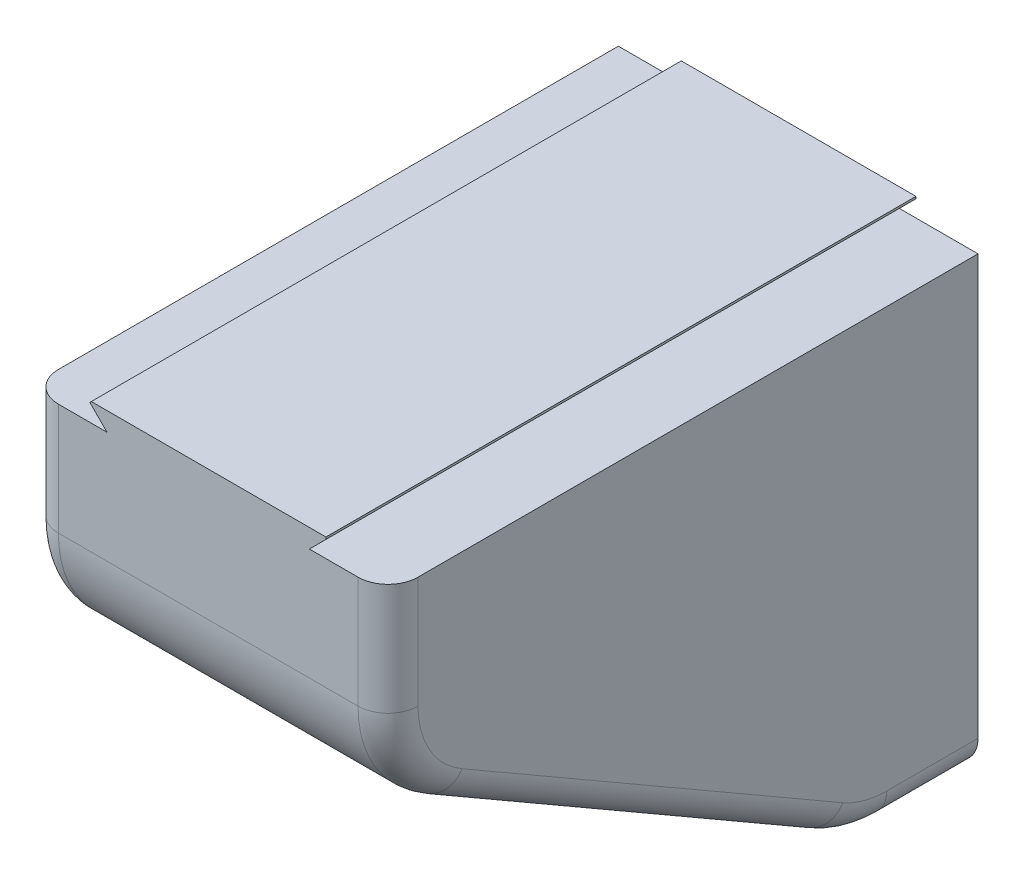
ISO-10303-21;
HEADER;
FILE_DESCRIPTION(('STEP AP214'),'2;1');
FILE_NAME('part.step','',(''),(''),'','','');
FILE_SCHEMA(('AUTOMOTIVE_DESIGN { 1 0 10303 214 1 1 1 1 }'));
ENDSEC;
DATA;
#1=APPLICATION_CONTEXT('core data for automotive mechanical design processes');
#2=APPLICATION_PROTOCOL_DEFINITION('international standard','automotive_design',2000,#1);
#3=PRODUCT_CONTEXT('',#1,'mechanical');
#4=PRODUCT('Part','Part','',(#3));
#5=PRODUCT_RELATED_PRODUCT_CATEGORY('part','',(#4));
#6=PRODUCT_DEFINITION_FORMATION('','',#4);
#7=PRODUCT_DEFINITION_CONTEXT('part definition',#1,'design');
#8=PRODUCT_DEFINITION('design','',#6,#7);
#9=PRODUCT_DEFINITION_SHAPE('','',#8);
#10=(LENGTH_UNIT() NAMED_UNIT(*) SI_UNIT(.MILLI.,.METRE.));
#11=(NAMED_UNIT(*) PLANE_ANGLE_UNIT() SI_UNIT($,.RADIAN.));
#12=(NAMED_UNIT(*) SI_UNIT($,.STERADIAN.) SOLID_ANGLE_UNIT());
#13=UNCERTAINTY_MEASURE_WITH_UNIT(LENGTH_MEASURE(1.E-05),#10,'distance_accuracy_value','');
#14=(GEOMETRIC_REPRESENTATION_CONTEXT(3) GLOBAL_UNCERTAINTY_ASSIGNED_CONTEXT((#13)) GLOBAL_UNIT_ASSIGNED_CONTEXT((#10,
#11,#12)) REPRESENTATION_CONTEXT('',''));
#15=CARTESIAN_POINT('',(0.,0.,0.));
#16=DIRECTION('',(0.,0.,1.));
#17=DIRECTION('',(1.,0.,0.));
#18=AXIS2_PLACEMENT_3D('',#15,#16,#17);
#19=CARTESIAN_POINT('',(152.4,0.,0.));
#20=DIRECTION('',(0.,-1.,0.));
#21=DIRECTION('',(0.,0.,-1.));
#22=AXIS2_PLACEMENT_3D('',#19,#20,#21);
#23=PLANE('',#22);
#24=DIRECTION('',(-1.,0.,0.));
#25=VECTOR('',#24,1.);
#26=CARTESIAN_POINT('',(152.4,0.,500.));
#27=LINE('',#26,#25);
#28=CARTESIAN_POINT('',(127.,0.,500.));
#29=VERTEX_POINT('',#28);
#30=CARTESIAN_POINT('',(85.7249999999998,0.,500.));
#31=VERTEX_POINT('',#30);
#32=EDGE_CURVE('E204',#29,#31,#27,.T.);
#33=ORIENTED_EDGE('',*,*,#32,.F.);
#34=CARTESIAN_POINT('',(127.,0.,474.6));
#35=DIRECTION('',(0.,-1.,0.));
#36=DIRECTION('',(0.,0.,-1.));
#37=AXIS2_PLACEMENT_3D('',#34,#35,#36);
#38=CIRCLE('',#37,25.4);
#39=CARTESIAN_POINT('',(152.4,0.,474.6));
#40=VERTEX_POINT('',#39);
#41=EDGE_CURVE('E11',#29,#40,#38,.F.);
#42=ORIENTED_EDGE('',*,*,#41,.T.);
#43=DIRECTION('',(0.,0.,1.));
#44=VECTOR('',#43,1.);
#45=CARTESIAN_POINT('',(152.4,0.,0.));
#46=LINE('',#45,#44);
#47=CARTESIAN_POINT('',(152.4,0.,0.));
#48=VERTEX_POINT('',#47);
#49=EDGE_CURVE('E197',#48,#40,#46,.T.);
#50=ORIENTED_EDGE('',*,*,#49,.F.);
#51=DIRECTION('',(-1.,0.,0.));
#52=VECTOR('',#51,1.);
#53=CARTESIAN_POINT('',(152.4,0.,0.));
#54=LINE('',#53,#52);
#55=CARTESIAN_POINT('',(85.7249999999998,0.,0.));
#56=VERTEX_POINT('',#55);
#57=EDGE_CURVE('E177',#48,#56,#54,.T.);
#58=ORIENTED_EDGE('',*,*,#57,.T.);
#59=DIRECTION('',(0.,0.,-1.));
#60=VECTOR('',#59,1.);
#61=CARTESIAN_POINT('',(85.7249999999998,0.,500.));
#62=LINE('',#61,#60);
#63=EDGE_CURVE('E187',#31,#56,#62,.T.);
#64=ORIENTED_EDGE('',*,*,#63,.F.);
#65=EDGE_LOOP('',(#33,#42,#50,#58,#64));
#66=FACE_BOUND('',#65,.T.);
#67=ADVANCED_FACE('F40',(#66),#23,.F.);
#68=CARTESIAN_POINT('',(152.4,-381.,0.));
#69=DIRECTION('',(0.,0.,1.));
#70=DIRECTION('',(1.,0.,0.));
#71=AXIS2_PLACEMENT_3D('',#68,#69,#70);
#72=PLANE('',#71);
#73=DIRECTION('',(-1.,0.,0.));
#74=VECTOR('',#73,1.);
#75=CARTESIAN_POINT('',(152.4,-381.,0.));
#76=LINE('',#75,#74);
#77=CARTESIAN_POINT('',(127.,-381.,0.));
#78=VERTEX_POINT('',#77);
#79=CARTESIAN_POINT('',(-127.,-381.,0.));
#80=VERTEX_POINT('',#79);
#81=EDGE_CURVE('E215',#78,#80,#76,.T.);
#82=ORIENTED_EDGE('',*,*,#81,.T.);
#83=CARTESIAN_POINT('',(-127.,-355.6,0.));
#84=DIRECTION('',(0.,0.,1.));
#85=DIRECTION('',(1.,0.,0.));
#86=AXIS2_PLACEMENT_3D('',#83,#84,#85);
#87=CIRCLE('',#86,25.4);
#88=CARTESIAN_POINT('',(-152.4,-355.6,0.));
#89=VERTEX_POINT('',#88);
#90=EDGE_CURVE('E324',#80,#89,#87,.F.);
#91=ORIENTED_EDGE('',*,*,#90,.T.);
#92=DIRECTION('',(0.,1.,0.));
#93=VECTOR('',#92,1.);
#94=CARTESIAN_POINT('',(-152.4,-381.,0.));
#95=LINE('',#94,#93);
#96=CARTESIAN_POINT('',(-152.4,0.,0.));
#97=VERTEX_POINT('',#96);
#98=EDGE_CURVE('E192',#89,#97,#95,.T.);
#99=ORIENTED_EDGE('',*,*,#98,.T.);
#100=CARTESIAN_POINT('',(-85.7250000000001,0.,0.));
#101=VERTEX_POINT('',#100);
#102=EDGE_CURVE('E199',#101,#97,#54,.T.);
#103=ORIENTED_EDGE('',*,*,#102,.F.);
#104=DIRECTION('',(-0.707106781186543,0.707106781186552,0.));
#105=VECTOR('',#104,1.);
#106=CARTESIAN_POINT('',(-101.6,15.875,0.));
#107=LINE('',#106,#105);
#108=CARTESIAN_POINT('',(-100.33,14.605,0.));
#109=VERTEX_POINT('',#108);
#110=EDGE_CURVE('E250',#101,#109,#107,.T.);
#111=ORIENTED_EDGE('',*,*,#110,.T.);
#112=DIRECTION('',(-0.707106781186528,-0.707106781186567,0.));
#113=VECTOR('',#112,1.);
#114=CARTESIAN_POINT('',(-100.33,14.605,0.));
#115=LINE('',#114,#113);
#116=CARTESIAN_POINT('',(-99.0600000000001,15.875,0.));
#117=VERTEX_POINT('',#116);
#118=EDGE_CURVE('E378',#109,#117,#115,.F.);
#119=ORIENTED_EDGE('',*,*,#118,.T.);
#120=DIRECTION('',(1.,0.,0.));
#121=VECTOR('',#120,1.);
#122=CARTESIAN_POINT('',(101.6,15.875,0.));
#123=LINE('',#122,#121);
#124=CARTESIAN_POINT('',(99.8039487757862,15.875,0.));
#125=VERTEX_POINT('',#124);
#126=EDGE_CURVE('E183',#117,#125,#123,.T.);
#127=ORIENTED_EDGE('',*,*,#126,.T.);
#128=DIRECTION('',(0.,1.,0.));
#129=VECTOR('',#128,1.);
#130=CARTESIAN_POINT('',(99.8039487757862,15.875,0.));
#131=LINE('',#130,#129);
#132=CARTESIAN_POINT('',(99.8039487757862,14.0789487757862,0.));
#133=VERTEX_POINT('',#132);
#134=EDGE_CURVE('E179',#125,#133,#131,.F.);
#135=ORIENTED_EDGE('',*,*,#134,.T.);
#136=DIRECTION('',(-0.707106781186551,-0.707106781186544,0.));
#137=VECTOR('',#136,1.);
#138=CARTESIAN_POINT('',(85.7249999999998,0.,0.));
#139=LINE('',#138,#137);
#140=EDGE_CURVE('E172',#133,#56,#139,.T.);
#141=ORIENTED_EDGE('',*,*,#140,.T.);
#142=ORIENTED_EDGE('',*,*,#57,.F.);
#143=DIRECTION('',(0.,1.,0.));
#144=VECTOR('',#143,1.);
#145=CARTESIAN_POINT('',(152.4,-381.,0.));
#146=LINE('',#145,#144);
#147=CARTESIAN_POINT('',(152.4,-355.6,0.));
#148=VERTEX_POINT('',#147);
#149=EDGE_CURVE('E274',#148,#48,#146,.T.);
#150=ORIENTED_EDGE('',*,*,#149,.F.);
#151=CARTESIAN_POINT('',(127.,-355.6,0.));
#152=DIRECTION('',(0.,0.,1.));
#153=DIRECTION('',(1.,0.,0.));
#154=AXIS2_PLACEMENT_3D('',#151,#152,#153);
#155=CIRCLE('',#154,25.4);
#156=EDGE_CURVE('E277',#148,#78,#155,.F.);
#157=ORIENTED_EDGE('',*,*,#156,.T.);
#158=EDGE_LOOP('',(#82,#91,#99,#103,#111,#119,#127,#135,#141,#142,#150,#157));
#159=FACE_BOUND('',#158,.T.);
#160=ADVANCED_FACE('F42',(#159),#72,.F.);
#161=DIRECTION('',(0.,0.,1.));
#162=VECTOR('',#161,1.);
#163=CARTESIAN_POINT('',(-152.4,0.,0.));
#164=LINE('',#163,#162);
#165=CARTESIAN_POINT('',(-152.4,0.,474.6));
#166=VERTEX_POINT('',#165);
#167=EDGE_CURVE('E279',#97,#166,#164,.T.);
#168=ORIENTED_EDGE('',*,*,#167,.T.);
#169=CARTESIAN_POINT('',(-127.,0.,474.6));
#170=DIRECTION('',(0.,-1.,0.));
#171=DIRECTION('',(0.,0.,-1.));
#172=AXIS2_PLACEMENT_3D('',#169,#170,#171);
#173=CIRCLE('',#172,25.4);
#174=CARTESIAN_POINT('',(-127.,0.,500.));
#175=VERTEX_POINT('',#174);
#176=EDGE_CURVE('E48',#166,#175,#173,.F.);
#177=ORIENTED_EDGE('',*,*,#176,.T.);
#178=CARTESIAN_POINT('',(-85.7250000000002,0.,500.));
#179=VERTEX_POINT('',#178);
#180=EDGE_CURVE('E208',#179,#175,#27,.T.);
#181=ORIENTED_EDGE('',*,*,#180,.F.);
#182=DIRECTION('',(0.,0.,-1.));
#183=VECTOR('',#182,1.);
#184=CARTESIAN_POINT('',(-85.7250000000002,0.,500.));
#185=LINE('',#184,#183);
#186=EDGE_CURVE('E193',#179,#101,#185,.T.);
#187=ORIENTED_EDGE('',*,*,#186,.T.);
#188=ORIENTED_EDGE('',*,*,#102,.T.);
#189=EDGE_LOOP('',(#168,#177,#181,#187,#188));
#190=FACE_BOUND('',#189,.T.);
#191=ADVANCED_FACE('F376',(#190),#23,.F.);
#192=CARTESIAN_POINT('',(152.4,0.,500.));
#193=DIRECTION('',(0.,0.,-1.));
#194=DIRECTION('',(-1.,0.,0.));
#195=AXIS2_PLACEMENT_3D('',#192,#193,#194);
#196=PLANE('',#195);
#197=ORIENTED_EDGE('',*,*,#180,.T.);
#198=DIRECTION('',(0.,-1.,0.));
#199=VECTOR('',#198,1.);
#200=CARTESIAN_POINT('',(-127.,0.,500.));
#201=LINE('',#200,#199);
#202=CARTESIAN_POINT('',(-127.,-94.6649730810375,500.));
#203=VERTEX_POINT('',#202);
#204=EDGE_CURVE('E224',#175,#203,#201,.T.);
#205=ORIENTED_EDGE('',*,*,#204,.T.);
#206=DIRECTION('',(-1.,0.,0.));
#207=VECTOR('',#206,1.);
#208=CARTESIAN_POINT('',(152.4,-94.6649730810375,500.));
#209=LINE('',#208,#207);
#210=CARTESIAN_POINT('',(127.,-94.6649730810375,500.));
#211=VERTEX_POINT('',#210);
#212=EDGE_CURVE('E228',#203,#211,#209,.F.);
#213=ORIENTED_EDGE('',*,*,#212,.T.);
#214=DIRECTION('',(0.,-1.,0.));
#215=VECTOR('',#214,1.);
#216=CARTESIAN_POINT('',(127.,0.,500.));
#217=LINE('',#216,#215);
#218=EDGE_CURVE('E62',#211,#29,#217,.F.);
#219=ORIENTED_EDGE('',*,*,#218,.T.);
#220=ORIENTED_EDGE('',*,*,#32,.T.);
#221=DIRECTION('',(-0.707106781186551,-0.707106781186544,0.));
#222=VECTOR('',#221,1.);
#223=CARTESIAN_POINT('',(85.7249999999998,0.,500.));
#224=LINE('',#223,#222);
#225=CARTESIAN_POINT('',(99.8039487757862,14.0789487757862,500.));
#226=VERTEX_POINT('',#225);
#227=EDGE_CURVE('E190',#226,#31,#224,.T.);
#228=ORIENTED_EDGE('',*,*,#227,.F.);
#229=DIRECTION('',(0.,-1.,0.));
#230=VECTOR('',#229,1.);
#231=CARTESIAN_POINT('',(99.8039487757862,15.875,500.));
#232=LINE('',#231,#230);
#233=CARTESIAN_POINT('',(99.8039487757862,15.875,500.));
#234=VERTEX_POINT('',#233);
#235=EDGE_CURVE('E306',#226,#234,#232,.F.);
#236=ORIENTED_EDGE('',*,*,#235,.T.);
#237=DIRECTION('',(1.,0.,0.));
#238=VECTOR('',#237,1.);
#239=CARTESIAN_POINT('',(101.6,15.875,500.));
#240=LINE('',#239,#238);
#241=CARTESIAN_POINT('',(-99.0600000000001,15.875,500.));
#242=VERTEX_POINT('',#241);
#243=EDGE_CURVE('E295',#242,#234,#240,.T.);
#244=ORIENTED_EDGE('',*,*,#243,.F.);
#245=DIRECTION('',(0.707106781186528,0.707106781186567,0.));
#246=VECTOR('',#245,1.);
#247=CARTESIAN_POINT('',(-100.33,14.605,500.));
#248=LINE('',#247,#246);
#249=CARTESIAN_POINT('',(-100.33,14.605,500.));
#250=VERTEX_POINT('',#249);
#251=EDGE_CURVE('E308',#242,#250,#248,.F.);
#252=ORIENTED_EDGE('',*,*,#251,.T.);
#253=DIRECTION('',(-0.707106781186543,0.707106781186552,0.));
#254=VECTOR('',#253,1.);
#255=CARTESIAN_POINT('',(-101.6,15.875,500.));
#256=LINE('',#255,#254);
#257=EDGE_CURVE('E182',#179,#250,#256,.T.);
#258=ORIENTED_EDGE('',*,*,#257,.F.);
#259=EDGE_LOOP('',(#197,#205,#213,#219,#220,#228,#236,#244,#252,#258));
#260=FACE_BOUND('',#259,.T.);
#261=ADVANCED_FACE('F227',(#260),#196,.F.);
#262=CARTESIAN_POINT('',(152.4,-381.,104.053185389756));
#263=DIRECTION('',(0.,0.866025403784438,-0.500000000000001));
#264=DIRECTION('',(0.,0.500000000000001,0.866025403784438));
#265=AXIS2_PLACEMENT_3D('',#262,#263,#264);
#266=PLANE('',#265);
#267=DIRECTION('',(-1.,0.,0.));
#268=VECTOR('',#267,1.);
#269=CARTESIAN_POINT('',(152.4,-181.267513459481,450.));
#270=LINE('',#269,#268);
#271=CARTESIAN_POINT('',(127.,-181.267513459481,450.));
#272=VERTEX_POINT('',#271);
#273=CARTESIAN_POINT('',(-127.,-181.267513459481,450.));
#274=VERTEX_POINT('',#273);
#275=EDGE_CURVE('E315',#272,#274,#270,.T.);
#276=ORIENTED_EDGE('',*,*,#275,.T.);
#277=DIRECTION('',(0.,-0.500000000000001,-0.866025403784438));
#278=VECTOR('',#277,1.);
#279=CARTESIAN_POINT('',(-127.,-381.,104.053185389756));
#280=LINE('',#279,#278);
#281=CARTESIAN_POINT('',(-127.,-367.602540378444,127.258266146643));
#282=VERTEX_POINT('',#281);
#283=EDGE_CURVE('E261',#274,#282,#280,.T.);
#284=ORIENTED_EDGE('',*,*,#283,.T.);
#285=DIRECTION('',(-1.,0.,0.));
#286=VECTOR('',#285,1.);
#287=CARTESIAN_POINT('',(152.4,-367.602540378444,127.258266146643));
#288=LINE('',#287,#286);
#289=CARTESIAN_POINT('',(127.,-367.602540378444,127.258266146643));
#290=VERTEX_POINT('',#289);
#291=EDGE_CURVE('E241',#282,#290,#288,.F.);
#292=ORIENTED_EDGE('',*,*,#291,.T.);
#293=DIRECTION('',(0.,-0.500000000000001,-0.866025403784438));
#294=VECTOR('',#293,1.);
#295=CARTESIAN_POINT('',(127.,-181.267513459481,450.));
#296=LINE('',#295,#294);
#297=EDGE_CURVE('E339',#290,#272,#296,.F.);
#298=ORIENTED_EDGE('',*,*,#297,.T.);
#299=EDGE_LOOP('',(#276,#284,#292,#298));
#300=FACE_BOUND('',#299,.T.);
#301=ADVANCED_FACE('F342',(#300),#266,.F.);
#302=CARTESIAN_POINT('',(152.4,-381.,0.));
#303=DIRECTION('',(0.,1.,0.));
#304=DIRECTION('',(0.,0.,1.));
#305=AXIS2_PLACEMENT_3D('',#302,#303,#304);
#306=PLANE('',#305);
#307=DIRECTION('',(-1.,0.,0.));
#308=VECTOR('',#307,1.);
#309=CARTESIAN_POINT('',(152.4,-381.,77.2582661466433));
#310=LINE('',#309,#308);
#311=CARTESIAN_POINT('',(127.,-381.,77.2582661466433));
#312=VERTEX_POINT('',#311);
#313=CARTESIAN_POINT('',(-127.,-381.,77.2582661466433));
#314=VERTEX_POINT('',#313);
#315=EDGE_CURVE('E312',#312,#314,#310,.T.);
#316=ORIENTED_EDGE('',*,*,#315,.T.);
#317=DIRECTION('',(0.,0.,-1.));
#318=VECTOR('',#317,1.);
#319=CARTESIAN_POINT('',(-127.,-381.,0.));
#320=LINE('',#319,#318);
#321=EDGE_CURVE('E320',#314,#80,#320,.T.);
#322=ORIENTED_EDGE('',*,*,#321,.T.);
#323=ORIENTED_EDGE('',*,*,#81,.F.);
#324=DIRECTION('',(0.,0.,-1.));
#325=VECTOR('',#324,1.);
#326=CARTESIAN_POINT('',(127.,-381.,77.2582661466433));
#327=LINE('',#326,#325);
#328=EDGE_CURVE('E240',#78,#312,#327,.F.);
#329=ORIENTED_EDGE('',*,*,#328,.T.);
#330=EDGE_LOOP('',(#316,#322,#323,#329));
#331=FACE_BOUND('',#330,.T.);
#332=ADVANCED_FACE('F369',(#331),#306,.F.);
#333=CARTESIAN_POINT('',(152.4,-381.,0.));
#334=DIRECTION('',(1.,0.,0.));
#335=DIRECTION('',(0.,0.,-1.));
#336=AXIS2_PLACEMENT_3D('',#333,#334,#335);
#337=PLANE('',#336);
#338=CARTESIAN_POINT('',(152.4,-281.,77.2582661466433));
#339=DIRECTION('',(1.,0.,0.));
#340=DIRECTION('',(0.,0.,-1.));
#341=AXIS2_PLACEMENT_3D('',#338,#339,#340);
#342=CIRCLE('',#341,74.6);
#343=CARTESIAN_POINT('',(152.4,-345.605495122319,114.558266146643));
#344=VERTEX_POINT('',#343);
#345=CARTESIAN_POINT('',(152.4,-355.6,77.2582661466433));
#346=VERTEX_POINT('',#345);
#347=EDGE_CURVE('E267',#344,#346,#342,.T.);
#348=ORIENTED_EDGE('',*,*,#347,.T.);
#349=DIRECTION('',(0.,0.,-1.));
#350=VECTOR('',#349,1.);
#351=CARTESIAN_POINT('',(152.4,-355.6,0.));
#352=LINE('',#351,#350);
#353=EDGE_CURVE('E221',#346,#148,#352,.T.);
#354=ORIENTED_EDGE('',*,*,#353,.T.);
#355=ORIENTED_EDGE('',*,*,#149,.T.);
#356=ORIENTED_EDGE('',*,*,#49,.T.);
#357=DIRECTION('',(0.,-1.,0.));
#358=VECTOR('',#357,1.);
#359=CARTESIAN_POINT('',(152.4,-94.6649730810375,474.6));
#360=LINE('',#359,#358);
#361=CARTESIAN_POINT('',(152.4,-94.6649730810375,474.6));
#362=VERTEX_POINT('',#361);
#363=EDGE_CURVE('E257',#40,#362,#360,.T.);
#364=ORIENTED_EDGE('',*,*,#363,.T.);
#365=CARTESIAN_POINT('',(152.4,-94.6649730810375,400.));
#366=DIRECTION('',(1.,0.,0.));
#367=DIRECTION('',(0.,0.,-1.));
#368=AXIS2_PLACEMENT_3D('',#365,#366,#367);
#369=CIRCLE('',#368,74.6);
#370=CARTESIAN_POINT('',(152.4,-159.270468203357,437.3));
#371=VERTEX_POINT('',#370);
#372=EDGE_CURVE('E259',#362,#371,#369,.T.);
#373=ORIENTED_EDGE('',*,*,#372,.T.);
#374=DIRECTION('',(0.,-0.500000000000001,-0.866025403784438));
#375=VECTOR('',#374,1.);
#376=CARTESIAN_POINT('',(152.4,-345.605495122319,114.558266146643));
#377=LINE('',#376,#375);
#378=EDGE_CURVE('E266',#371,#344,#377,.T.);
#379=ORIENTED_EDGE('',*,*,#378,.T.);
#380=EDGE_LOOP('',(#348,#354,#355,#356,#364,#373,#379));
#381=FACE_BOUND('',#380,.T.);
#382=ADVANCED_FACE('F273',(#381),#337,.T.);
#383=CARTESIAN_POINT('',(-152.4,-381.,0.));
#384=DIRECTION('',(1.,0.,0.));
#385=DIRECTION('',(0.,0.,-1.));
#386=AXIS2_PLACEMENT_3D('',#383,#384,#385);
#387=PLANE('',#386);
#388=ORIENTED_EDGE('',*,*,#98,.F.);
#389=DIRECTION('',(0.,0.,-1.));
#390=VECTOR('',#389,1.);
#391=CARTESIAN_POINT('',(-152.4,-355.6,0.));
#392=LINE('',#391,#390);
#393=CARTESIAN_POINT('',(-152.4,-355.6,77.2582661466433));
#394=VERTEX_POINT('',#393);
#395=EDGE_CURVE('E333',#89,#394,#392,.F.);
#396=ORIENTED_EDGE('',*,*,#395,.T.);
#397=CARTESIAN_POINT('',(-152.4,-281.,77.2582661466433));
#398=DIRECTION('',(1.,0.,0.));
#399=DIRECTION('',(0.,0.,-1.));
#400=AXIS2_PLACEMENT_3D('',#397,#398,#399);
#401=CIRCLE('',#400,74.6);
#402=CARTESIAN_POINT('',(-152.4,-345.605495122319,114.558266146643));
#403=VERTEX_POINT('',#402);
#404=EDGE_CURVE('E331',#394,#403,#401,.F.);
#405=ORIENTED_EDGE('',*,*,#404,.T.);
#406=DIRECTION('',(0.,-0.500000000000001,-0.866025403784438));
#407=VECTOR('',#406,1.);
#408=CARTESIAN_POINT('',(-152.4,-404.059305689985,13.313296347439));
#409=LINE('',#408,#407);
#410=CARTESIAN_POINT('',(-152.4,-159.270468203357,437.3));
#411=VERTEX_POINT('',#410);
#412=EDGE_CURVE('E329',#403,#411,#409,.F.);
#413=ORIENTED_EDGE('',*,*,#412,.T.);
#414=CARTESIAN_POINT('',(-152.4,-94.6649730810375,400.));
#415=DIRECTION('',(1.,0.,0.));
#416=DIRECTION('',(0.,0.,-1.));
#417=AXIS2_PLACEMENT_3D('',#414,#415,#416);
#418=CIRCLE('',#417,74.6);
#419=CARTESIAN_POINT('',(-152.4,-94.6649730810375,474.6));
#420=VERTEX_POINT('',#419);
#421=EDGE_CURVE('E327',#411,#420,#418,.F.);
#422=ORIENTED_EDGE('',*,*,#421,.T.);
#423=DIRECTION('',(0.,-1.,0.));
#424=VECTOR('',#423,1.);
#425=CARTESIAN_POINT('',(-152.4,-381.,474.6));
#426=LINE('',#425,#424);
#427=EDGE_CURVE('E247',#420,#166,#426,.F.);
#428=ORIENTED_EDGE('',*,*,#427,.T.);
#429=ORIENTED_EDGE('',*,*,#167,.F.);
#430=EDGE_LOOP('',(#388,#396,#405,#413,#422,#428,#429));
#431=FACE_BOUND('',#430,.T.);
#432=ADVANCED_FACE('F375',(#431),#387,.F.);
#433=CARTESIAN_POINT('',(85.7249999999998,0.,500.));
#434=DIRECTION('',(0.707106781186544,-0.707106781186551,0.));
#435=DIRECTION('',(0.707106781186551,0.707106781186544,0.));
#436=AXIS2_PLACEMENT_3D('',#433,#434,#435);
#437=PLANE('',#436);
#438=ORIENTED_EDGE('',*,*,#140,.F.);
#439=DIRECTION('',(0.,0.,1.));
#440=VECTOR('',#439,1.);
#441=CARTESIAN_POINT('',(99.8039487757862,14.0789487757862,500.));
#442=LINE('',#441,#440);
#443=EDGE_CURVE('E310',#133,#226,#442,.T.);
#444=ORIENTED_EDGE('',*,*,#443,.T.);
#445=ORIENTED_EDGE('',*,*,#227,.T.);
#446=ORIENTED_EDGE('',*,*,#63,.T.);
#447=EDGE_LOOP('',(#438,#444,#445,#446));
#448=FACE_BOUND('',#447,.T.);
#449=ADVANCED_FACE('F188',(#448),#437,.T.);
#450=CARTESIAN_POINT('',(101.6,15.875,500.));
#451=DIRECTION('',(0.,1.,0.));
#452=DIRECTION('',(0.,0.,1.));
#453=AXIS2_PLACEMENT_3D('',#450,#451,#452);
#454=PLANE('',#453);
#455=ORIENTED_EDGE('',*,*,#126,.F.);
#456=DIRECTION('',(0.,0.,1.));
#457=VECTOR('',#456,1.);
#458=CARTESIAN_POINT('',(-99.0600000000001,15.875,500.));
#459=LINE('',#458,#457);
#460=EDGE_CURVE('E304',#117,#242,#459,.T.);
#461=ORIENTED_EDGE('',*,*,#460,.T.);
#462=ORIENTED_EDGE('',*,*,#243,.T.);
#463=DIRECTION('',(0.,0.,-1.));
#464=VECTOR('',#463,1.);
#465=CARTESIAN_POINT('',(99.8039487757862,15.875,500.));
#466=LINE('',#465,#464);
#467=EDGE_CURVE('E389',#234,#125,#466,.T.);
#468=ORIENTED_EDGE('',*,*,#467,.T.);
#469=EDGE_LOOP('',(#455,#461,#462,#468));
#470=FACE_BOUND('',#469,.T.);
#471=ADVANCED_FACE('F388',(#470),#454,.T.);
#472=CARTESIAN_POINT('',(-101.6,15.875,500.));
#473=DIRECTION('',(-0.707106781186552,-0.707106781186543,0.));
#474=DIRECTION('',(0.707106781186543,-0.707106781186552,0.));
#475=AXIS2_PLACEMENT_3D('',#472,#473,#474);
#476=PLANE('',#475);
#477=ORIENTED_EDGE('',*,*,#257,.T.);
#478=DIRECTION('',(0.,0.,-1.));
#479=VECTOR('',#478,1.);
#480=CARTESIAN_POINT('',(-100.33,14.605,500.));
#481=LINE('',#480,#479);
#482=EDGE_CURVE('E198',#250,#109,#481,.T.);
#483=ORIENTED_EDGE('',*,*,#482,.T.);
#484=ORIENTED_EDGE('',*,*,#110,.F.);
#485=ORIENTED_EDGE('',*,*,#186,.F.);
#486=EDGE_LOOP('',(#477,#483,#484,#485));
#487=FACE_BOUND('',#486,.T.);
#488=ADVANCED_FACE('F449',(#487),#476,.T.);
#489=CARTESIAN_POINT('',(-100.33,14.605,500.));
#490=DIRECTION('',(0.707106781186567,-0.707106781186528,0.));
#491=DIRECTION('',(0.707106781186528,0.707106781186567,0.));
#492=AXIS2_PLACEMENT_3D('',#489,#490,#491);
#493=PLANE('',#492);
#494=ORIENTED_EDGE('',*,*,#251,.F.);
#495=ORIENTED_EDGE('',*,*,#460,.F.);
#496=ORIENTED_EDGE('',*,*,#118,.F.);
#497=ORIENTED_EDGE('',*,*,#482,.F.);
#498=EDGE_LOOP('',(#494,#495,#496,#497));
#499=FACE_BOUND('',#498,.T.);
#500=ADVANCED_FACE('F452',(#499),#493,.F.);
#501=CARTESIAN_POINT('',(99.8039487757862,15.875,500.));
#502=DIRECTION('',(-1.,0.,0.));
#503=DIRECTION('',(0.,-1.,0.));
#504=AXIS2_PLACEMENT_3D('',#501,#502,#503);
#505=PLANE('',#504);
#506=ORIENTED_EDGE('',*,*,#235,.F.);
#507=ORIENTED_EDGE('',*,*,#443,.F.);
#508=ORIENTED_EDGE('',*,*,#134,.F.);
#509=ORIENTED_EDGE('',*,*,#467,.F.);
#510=EDGE_LOOP('',(#506,#507,#508,#509));
#511=FACE_BOUND('',#510,.T.);
#512=ADVANCED_FACE('F394',(#511),#505,.F.);
#513=CARTESIAN_POINT('',(152.4,-281.,77.2582661466433));
#514=DIRECTION('',(-1.,0.,0.));
#515=DIRECTION('',(0.,0.,1.));
#516=AXIS2_PLACEMENT_3D('',#513,#514,#515);
#517=CYLINDRICAL_SURFACE('',#516,100.);
#518=ORIENTED_EDGE('',*,*,#291,.F.);
#519=CARTESIAN_POINT('',(-127.,-281.,77.2582661466433));
#520=DIRECTION('',(1.,0.,0.));
#521=DIRECTION('',(0.,0.,-1.));
#522=AXIS2_PLACEMENT_3D('',#519,#520,#521);
#523=CIRCLE('',#522,100.);
#524=EDGE_CURVE('E337',#282,#314,#523,.T.);
#525=ORIENTED_EDGE('',*,*,#524,.T.);
#526=ORIENTED_EDGE('',*,*,#315,.F.);
#527=CARTESIAN_POINT('',(127.,-281.,77.2582661466433));
#528=DIRECTION('',(1.,0.,0.));
#529=DIRECTION('',(0.,0.,-1.));
#530=AXIS2_PLACEMENT_3D('',#527,#528,#529);
#531=CIRCLE('',#530,100.);
#532=EDGE_CURVE('E335',#312,#290,#531,.F.);
#533=ORIENTED_EDGE('',*,*,#532,.T.);
#534=EDGE_LOOP('',(#518,#525,#526,#533));
#535=FACE_BOUND('',#534,.T.);
#536=ADVANCED_FACE('F347',(#535),#517,.T.);
#537=CARTESIAN_POINT('',(152.4,-94.6649730810375,400.));
#538=DIRECTION('',(-1.,0.,0.));
#539=DIRECTION('',(0.,0.,1.));
#540=AXIS2_PLACEMENT_3D('',#537,#538,#539);
#541=CYLINDRICAL_SURFACE('',#540,100.);
#542=ORIENTED_EDGE('',*,*,#212,.F.);
#543=CARTESIAN_POINT('',(-127.,-94.6649730810375,400.));
#544=DIRECTION('',(1.,0.,0.));
#545=DIRECTION('',(0.,0.,-1.));
#546=AXIS2_PLACEMENT_3D('',#543,#544,#545);
#547=CIRCLE('',#546,100.);
#548=EDGE_CURVE('E236',#203,#274,#547,.T.);
#549=ORIENTED_EDGE('',*,*,#548,.T.);
#550=ORIENTED_EDGE('',*,*,#275,.F.);
#551=CARTESIAN_POINT('',(127.,-94.6649730810375,400.));
#552=DIRECTION('',(1.,0.,0.));
#553=DIRECTION('',(0.,0.,-1.));
#554=AXIS2_PLACEMENT_3D('',#551,#552,#553);
#555=CIRCLE('',#554,100.);
#556=EDGE_CURVE('E239',#272,#211,#555,.F.);
#557=ORIENTED_EDGE('',*,*,#556,.T.);
#558=EDGE_LOOP('',(#542,#549,#550,#557));
#559=FACE_BOUND('',#558,.T.);
#560=ADVANCED_FACE('F233',(#559),#541,.T.);
#561=CARTESIAN_POINT('',(-127.,0.,474.6));
#562=DIRECTION('',(0.,-1.,0.));
#563=DIRECTION('',(0.,0.,-1.));
#564=AXIS2_PLACEMENT_3D('',#561,#562,#563);
#565=CYLINDRICAL_SURFACE('',#564,25.4);
#566=ORIENTED_EDGE('',*,*,#176,.F.);
#567=ORIENTED_EDGE('',*,*,#427,.F.);
#568=CARTESIAN_POINT('',(-127.,-94.6649730810375,474.6));
#569=DIRECTION('',(0.,-1.,0.));
#570=DIRECTION('',(0.,0.,-1.));
#571=AXIS2_PLACEMENT_3D('',#568,#569,#570);
#572=CIRCLE('',#571,25.4);
#573=EDGE_CURVE('E245',#203,#420,#572,.T.);
#574=ORIENTED_EDGE('',*,*,#573,.F.);
#575=ORIENTED_EDGE('',*,*,#204,.F.);
#576=EDGE_LOOP('',(#566,#567,#574,#575));
#577=FACE_BOUND('',#576,.T.);
#578=ADVANCED_FACE('F246',(#577),#565,.T.);
#579=CARTESIAN_POINT('',(-127.,-94.6649730810375,400.));
#580=DIRECTION('',(1.,0.,0.));
#581=DIRECTION('',(0.,0.,-1.));
#582=AXIS2_PLACEMENT_3D('',#579,#580,#581);
#583=TOROIDAL_SURFACE('',#582,74.6,25.4);
#584=ORIENTED_EDGE('',*,*,#573,.T.);
#585=ORIENTED_EDGE('',*,*,#421,.F.);
#586=CARTESIAN_POINT('',(-127.,-159.270468203357,437.3));
#587=DIRECTION('',(0.,-0.500000000000002,-0.866025403784438));
#588=DIRECTION('',(0.,0.866025403784438,-0.500000000000002));
#589=AXIS2_PLACEMENT_3D('',#586,#587,#588);
#590=CIRCLE('',#589,25.4);
#591=EDGE_CURVE('E251',#274,#411,#590,.T.);
#592=ORIENTED_EDGE('',*,*,#591,.F.);
#593=ORIENTED_EDGE('',*,*,#548,.F.);
#594=EDGE_LOOP('',(#584,#585,#592,#593));
#595=FACE_BOUND('',#594,.T.);
#596=ADVANCED_FACE('F254',(#595),#583,.T.);
#597=CARTESIAN_POINT('',(-127.,-359.002954743875,91.3531853897557));
#598=DIRECTION('',(0.,-0.500000000000001,-0.866025403784438));
#599=DIRECTION('',(0.,0.866025403784438,-0.500000000000001));
#600=AXIS2_PLACEMENT_3D('',#597,#598,#599);
#601=CYLINDRICAL_SURFACE('',#600,25.4);
#602=ORIENTED_EDGE('',*,*,#591,.T.);
#603=ORIENTED_EDGE('',*,*,#412,.F.);
#604=CARTESIAN_POINT('',(-127.,-345.605495122319,114.558266146643));
#605=DIRECTION('',(0.,-0.500000000000001,-0.866025403784438));
#606=DIRECTION('',(0.,0.866025403784438,-0.500000000000001));
#607=AXIS2_PLACEMENT_3D('',#604,#605,#606);
#608=CIRCLE('',#607,25.4);
#609=EDGE_CURVE('E353',#282,#403,#608,.T.);
#610=ORIENTED_EDGE('',*,*,#609,.F.);
#611=ORIENTED_EDGE('',*,*,#283,.F.);
#612=EDGE_LOOP('',(#602,#603,#610,#611));
#613=FACE_BOUND('',#612,.T.);
#614=ADVANCED_FACE('F354',(#613),#601,.T.);
#615=CARTESIAN_POINT('',(-127.,-281.,77.2582661466433));
#616=DIRECTION('',(1.,0.,0.));
#617=DIRECTION('',(0.,0.,-1.));
#618=AXIS2_PLACEMENT_3D('',#615,#616,#617);
#619=TOROIDAL_SURFACE('',#618,74.6,25.4);
#620=ORIENTED_EDGE('',*,*,#609,.T.);
#621=ORIENTED_EDGE('',*,*,#404,.F.);
#622=CARTESIAN_POINT('',(-127.,-355.6,77.2582661466433));
#623=DIRECTION('',(0.,0.,-1.));
#624=DIRECTION('',(-1.,0.,0.));
#625=AXIS2_PLACEMENT_3D('',#622,#623,#624);
#626=CIRCLE('',#625,25.4);
#627=EDGE_CURVE('E357',#314,#394,#626,.T.);
#628=ORIENTED_EDGE('',*,*,#627,.F.);
#629=ORIENTED_EDGE('',*,*,#524,.F.);
#630=EDGE_LOOP('',(#620,#621,#628,#629));
#631=FACE_BOUND('',#630,.T.);
#632=ADVANCED_FACE('F360',(#631),#619,.T.);
#633=CARTESIAN_POINT('',(-127.,-355.6,0.));
#634=DIRECTION('',(0.,0.,-1.));
#635=DIRECTION('',(-1.,0.,0.));
#636=AXIS2_PLACEMENT_3D('',#633,#634,#635);
#637=CYLINDRICAL_SURFACE('',#636,25.4);
#638=ORIENTED_EDGE('',*,*,#627,.T.);
#639=ORIENTED_EDGE('',*,*,#395,.F.);
#640=ORIENTED_EDGE('',*,*,#90,.F.);
#641=ORIENTED_EDGE('',*,*,#321,.F.);
#642=EDGE_LOOP('',(#638,#639,#640,#641));
#643=FACE_BOUND('',#642,.T.);
#644=ADVANCED_FACE('F367',(#643),#637,.T.);
#645=CARTESIAN_POINT('',(127.,-381.,474.6));
#646=DIRECTION('',(0.,1.,0.));
#647=DIRECTION('',(0.,0.,1.));
#648=AXIS2_PLACEMENT_3D('',#645,#646,#647);
#649=CYLINDRICAL_SURFACE('',#648,25.4);
#650=ORIENTED_EDGE('',*,*,#41,.F.);
#651=ORIENTED_EDGE('',*,*,#218,.F.);
#652=CARTESIAN_POINT('',(127.,-94.6649730810375,474.6));
#653=DIRECTION('',(0.,-1.,0.));
#654=DIRECTION('',(0.,0.,-1.));
#655=AXIS2_PLACEMENT_3D('',#652,#653,#654);
#656=CIRCLE('',#655,25.4);
#657=EDGE_CURVE('E365',#362,#211,#656,.T.);
#658=ORIENTED_EDGE('',*,*,#657,.F.);
#659=ORIENTED_EDGE('',*,*,#363,.F.);
#660=EDGE_LOOP('',(#650,#651,#658,#659));
#661=FACE_BOUND('',#660,.T.);
#662=ADVANCED_FACE('F400',(#661),#649,.T.);
#663=CARTESIAN_POINT('',(127.,-94.6649730810375,400.));
#664=DIRECTION('',(1.,0.,0.));
#665=DIRECTION('',(0.,0.,-1.));
#666=AXIS2_PLACEMENT_3D('',#663,#664,#665);
#667=TOROIDAL_SURFACE('',#666,74.6,25.4);
#668=ORIENTED_EDGE('',*,*,#657,.T.);
#669=ORIENTED_EDGE('',*,*,#556,.F.);
#670=CARTESIAN_POINT('',(127.,-159.270468203357,437.3));
#671=DIRECTION('',(0.,-0.500000000000002,-0.866025403784437));
#672=DIRECTION('',(0.,0.866025403784437,-0.500000000000002));
#673=AXIS2_PLACEMENT_3D('',#670,#671,#672);
#674=CIRCLE('',#673,25.4);
#675=EDGE_CURVE('E409',#371,#272,#674,.T.);
#676=ORIENTED_EDGE('',*,*,#675,.F.);
#677=ORIENTED_EDGE('',*,*,#372,.F.);
#678=EDGE_LOOP('',(#668,#669,#676,#677));
#679=FACE_BOUND('',#678,.T.);
#680=ADVANCED_FACE('F410',(#679),#667,.T.);
#681=CARTESIAN_POINT('',(127.,-404.059305689985,13.313296347439));
#682=DIRECTION('',(0.,0.500000000000001,0.866025403784438));
#683=DIRECTION('',(0.,-0.866025403784438,0.500000000000001));
#684=AXIS2_PLACEMENT_3D('',#681,#682,#683);
#685=CYLINDRICAL_SURFACE('',#684,25.4);
#686=ORIENTED_EDGE('',*,*,#675,.T.);
#687=ORIENTED_EDGE('',*,*,#297,.F.);
#688=CARTESIAN_POINT('',(127.,-345.605495122319,114.558266146643));
#689=DIRECTION('',(0.,-0.5,-0.866025403784439));
#690=DIRECTION('',(0.,0.866025403784439,-0.5));
#691=AXIS2_PLACEMENT_3D('',#688,#689,#690);
#692=CIRCLE('',#691,25.4);
#693=EDGE_CURVE('E412',#344,#290,#692,.T.);
#694=ORIENTED_EDGE('',*,*,#693,.F.);
#695=ORIENTED_EDGE('',*,*,#378,.F.);
#696=EDGE_LOOP('',(#686,#687,#694,#695));
#697=FACE_BOUND('',#696,.T.);
#698=ADVANCED_FACE('F414',(#697),#685,.T.);
#699=CARTESIAN_POINT('',(127.,-281.,77.2582661466433));
#700=DIRECTION('',(1.,0.,0.));
#701=DIRECTION('',(0.,0.,-1.));
#702=AXIS2_PLACEMENT_3D('',#699,#700,#701);
#703=TOROIDAL_SURFACE('',#702,74.6,25.4);
#704=ORIENTED_EDGE('',*,*,#693,.T.);
#705=ORIENTED_EDGE('',*,*,#532,.F.);
#706=CARTESIAN_POINT('',(127.,-355.6,77.2582661466433));
#707=DIRECTION('',(0.,0.,-1.));
#708=DIRECTION('',(-1.,0.,0.));
#709=AXIS2_PLACEMENT_3D('',#706,#707,#708);
#710=CIRCLE('',#709,25.4);
#711=EDGE_CURVE('E417',#346,#312,#710,.T.);
#712=ORIENTED_EDGE('',*,*,#711,.F.);
#713=ORIENTED_EDGE('',*,*,#347,.F.);
#714=EDGE_LOOP('',(#704,#705,#712,#713));
#715=FACE_BOUND('',#714,.T.);
#716=ADVANCED_FACE('F419',(#715),#703,.T.);
#717=CARTESIAN_POINT('',(127.,-355.6,0.));
#718=DIRECTION('',(0.,0.,1.));
#719=DIRECTION('',(1.,0.,0.));
#720=AXIS2_PLACEMENT_3D('',#717,#718,#719);
#721=CYLINDRICAL_SURFACE('',#720,25.4);
#722=ORIENTED_EDGE('',*,*,#711,.T.);
#723=ORIENTED_EDGE('',*,*,#328,.F.);
#724=ORIENTED_EDGE('',*,*,#156,.F.);
#725=ORIENTED_EDGE('',*,*,#353,.F.);
#726=EDGE_LOOP('',(#722,#723,#724,#725));
#727=FACE_BOUND('',#726,.T.);
#728=ADVANCED_FACE('F422',(#727),#721,.T.);
#729=CLOSED_SHELL('',(#67,#160,#191,#261,#301,#332,#382,#432,#449,#471,#488,#500,#512,#536,#560,
#578,#596,#614,#632,#644,#662,#680,#698,#716,#728));
#730=MANIFOLD_SOLID_BREP('B2',#729);
#731=ADVANCED_BREP_SHAPE_REPRESENTATION('',(#18,#730),#14);
#732=SHAPE_DEFINITION_REPRESENTATION(#9,#731);
ENDSEC;
END-ISO-10303-21;
